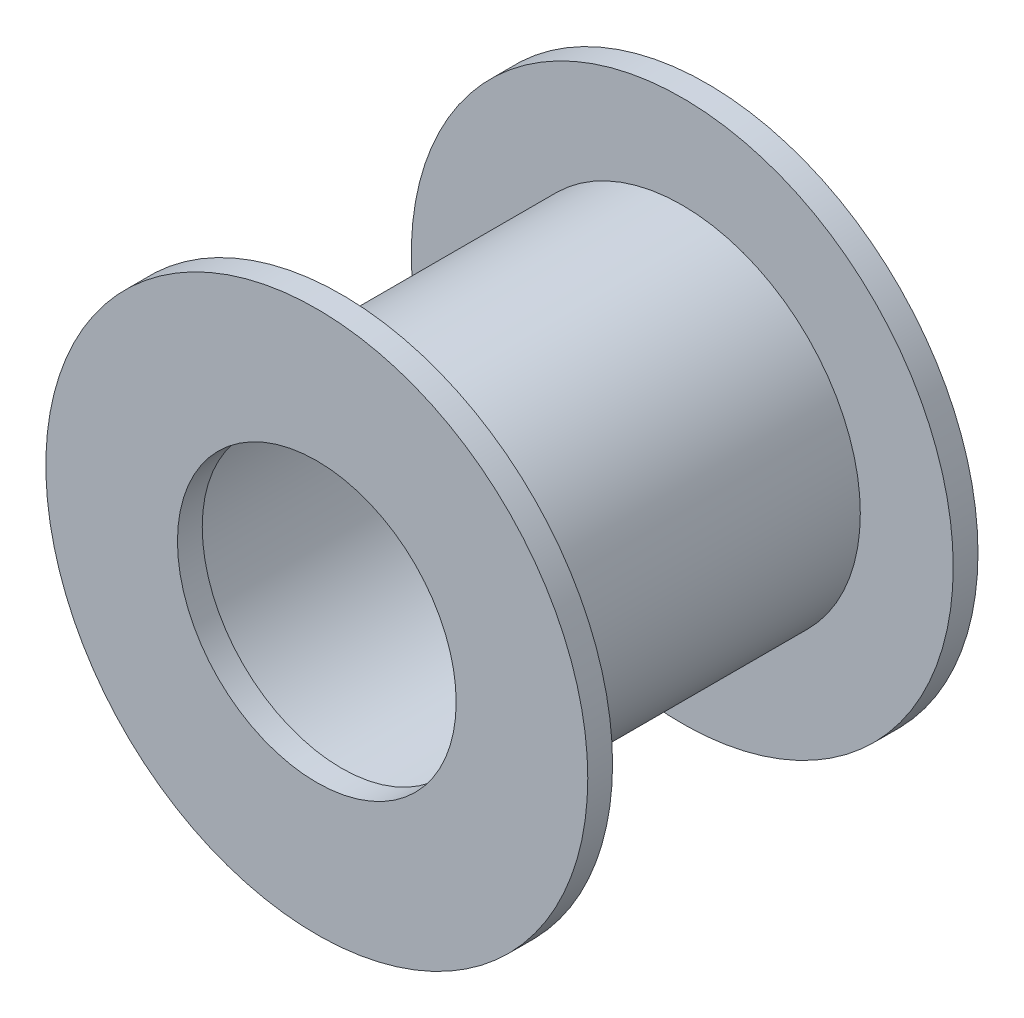
ISO-10303-21;
HEADER;
FILE_DESCRIPTION(('STEP AP214'),'2;1');
FILE_NAME('part.step','',(''),(''),'','','');
FILE_SCHEMA(('AUTOMOTIVE_DESIGN { 1 0 10303 214 1 1 1 1 }'));
ENDSEC;
DATA;
#1=APPLICATION_CONTEXT('core data for automotive mechanical design processes');
#2=APPLICATION_PROTOCOL_DEFINITION('international standard','automotive_design',2000,#1);
#3=PRODUCT_CONTEXT('',#1,'mechanical');
#4=PRODUCT('Part','Part','',(#3));
#5=PRODUCT_RELATED_PRODUCT_CATEGORY('part','',(#4));
#6=PRODUCT_DEFINITION_FORMATION('','',#4);
#7=PRODUCT_DEFINITION_CONTEXT('part definition',#1,'design');
#8=PRODUCT_DEFINITION('design','',#6,#7);
#9=PRODUCT_DEFINITION_SHAPE('','',#8);
#10=(LENGTH_UNIT() NAMED_UNIT(*) SI_UNIT(.MILLI.,.METRE.));
#11=(NAMED_UNIT(*) PLANE_ANGLE_UNIT() SI_UNIT($,.RADIAN.));
#12=(NAMED_UNIT(*) SI_UNIT($,.STERADIAN.) SOLID_ANGLE_UNIT());
#13=UNCERTAINTY_MEASURE_WITH_UNIT(LENGTH_MEASURE(1.E-05),#10,'distance_accuracy_value','');
#14=(GEOMETRIC_REPRESENTATION_CONTEXT(3) GLOBAL_UNCERTAINTY_ASSIGNED_CONTEXT((#13)) GLOBAL_UNIT_ASSIGNED_CONTEXT((#10,
#11,#12)) REPRESENTATION_CONTEXT('',''));
#15=CARTESIAN_POINT('',(0.,0.,0.));
#16=DIRECTION('',(0.,0.,1.));
#17=DIRECTION('',(1.,0.,0.));
#18=AXIS2_PLACEMENT_3D('',#15,#16,#17);
#19=CARTESIAN_POINT('',(0.,0.,252.));
#20=DIRECTION('',(0.,0.,-1.));
#21=DIRECTION('',(-1.,0.,0.));
#22=AXIS2_PLACEMENT_3D('',#19,#20,#21);
#23=CYLINDRICAL_SURFACE('',#22,175.);
#24=CARTESIAN_POINT('',(0.,0.,252.));
#25=DIRECTION('',(0.,0.,1.));
#26=DIRECTION('',(1.,0.,0.));
#27=AXIS2_PLACEMENT_3D('',#24,#25,#26);
#28=CIRCLE('',#27,175.);
#29=CARTESIAN_POINT('',(175.,0.,252.));
#30=VERTEX_POINT('',#29);
#31=EDGE_CURVE('E11',#30,#30,#28,.T.);
#32=ORIENTED_EDGE('',*,*,#31,.F.);
#33=EDGE_LOOP('',(#32));
#34=FACE_BOUND('',#33,.T.);
#35=CARTESIAN_POINT('',(0.,0.,236.));
#36=DIRECTION('',(0.,0.,1.));
#37=DIRECTION('',(1.,0.,0.));
#38=AXIS2_PLACEMENT_3D('',#35,#36,#37);
#39=CIRCLE('',#38,175.);
#40=CARTESIAN_POINT('',(175.,0.,236.));
#41=VERTEX_POINT('',#40);
#42=EDGE_CURVE('E49',#41,#41,#39,.T.);
#43=ORIENTED_EDGE('',*,*,#42,.T.);
#44=EDGE_LOOP('',(#43));
#45=FACE_BOUND('',#44,.T.);
#46=ADVANCED_FACE('F42',(#34,#45),#23,.T.);
#47=CARTESIAN_POINT('',(0.,0.,252.));
#48=DIRECTION('',(0.,0.,1.));
#49=DIRECTION('',(1.,0.,0.));
#50=AXIS2_PLACEMENT_3D('',#47,#48,#49);
#51=PLANE('',#50);
#52=CARTESIAN_POINT('',(0.,0.,252.));
#53=DIRECTION('',(0.,0.,1.));
#54=DIRECTION('',(1.,0.,0.));
#55=AXIS2_PLACEMENT_3D('',#52,#53,#54);
#56=CIRCLE('',#55,90.);
#57=CARTESIAN_POINT('',(90.,0.,252.));
#58=VERTEX_POINT('',#57);
#59=EDGE_CURVE('E55',#58,#58,#56,.T.);
#60=ORIENTED_EDGE('',*,*,#59,.F.);
#61=EDGE_LOOP('',(#60));
#62=FACE_BOUND('',#61,.T.);
#63=ORIENTED_EDGE('',*,*,#31,.T.);
#64=EDGE_LOOP('',(#63));
#65=FACE_BOUND('',#64,.T.);
#66=ADVANCED_FACE('F71',(#62,#65),#51,.T.);
#67=CARTESIAN_POINT('',(0.,0.,236.));
#68=DIRECTION('',(0.,0.,1.));
#69=DIRECTION('',(1.,0.,0.));
#70=AXIS2_PLACEMENT_3D('',#67,#68,#69);
#71=PLANE('',#70);
#72=CARTESIAN_POINT('',(0.,0.,236.));
#73=DIRECTION('',(0.,0.,1.));
#74=DIRECTION('',(1.,0.,0.));
#75=AXIS2_PLACEMENT_3D('',#72,#73,#74);
#76=CIRCLE('',#75,90.);
#77=CARTESIAN_POINT('',(90.,0.,236.));
#78=VERTEX_POINT('',#77);
#79=EDGE_CURVE('E45',#78,#78,#76,.T.);
#80=ORIENTED_EDGE('',*,*,#79,.T.);
#81=EDGE_LOOP('',(#80));
#82=FACE_BOUND('',#81,.T.);
#83=ORIENTED_EDGE('',*,*,#42,.F.);
#84=EDGE_LOOP('',(#83));
#85=FACE_BOUND('',#84,.T.);
#86=ADVANCED_FACE('F62',(#82,#85),#71,.F.);
#87=CARTESIAN_POINT('',(0.,0.,0.));
#88=DIRECTION('',(0.,0.,1.));
#89=DIRECTION('',(1.,0.,0.));
#90=AXIS2_PLACEMENT_3D('',#87,#88,#89);
#91=CYLINDRICAL_SURFACE('',#90,90.);
#92=ORIENTED_EDGE('',*,*,#59,.T.);
#93=EDGE_LOOP('',(#92));
#94=FACE_BOUND('',#93,.T.);
#95=ORIENTED_EDGE('',*,*,#79,.F.);
#96=EDGE_LOOP('',(#95));
#97=FACE_BOUND('',#96,.T.);
#98=ADVANCED_FACE('F65',(#94,#97),#91,.F.);
#99=CLOSED_SHELL('',(#46,#66,#86,#98));
#100=MANIFOLD_SOLID_BREP('B2',#99);
#101=CARTESIAN_POINT('',(0.,0.,236.));
#102=DIRECTION('',(0.,0.,1.));
#103=DIRECTION('',(1.,0.,0.));
#104=AXIS2_PLACEMENT_3D('',#101,#102,#103);
#105=PLANE('',#104);
#106=CARTESIAN_POINT('',(0.,0.,236.));
#107=DIRECTION('',(0.,0.,1.));
#108=DIRECTION('',(1.,0.,0.));
#109=AXIS2_PLACEMENT_3D('',#106,#107,#108);
#110=CIRCLE('',#109,115.);
#111=CARTESIAN_POINT('',(115.,0.,236.));
#112=VERTEX_POINT('',#111);
#113=EDGE_CURVE('E41',#112,#112,#110,.T.);
#114=ORIENTED_EDGE('',*,*,#113,.T.);
#115=EDGE_LOOP('',(#114));
#116=FACE_BOUND('',#115,.T.);
#117=CARTESIAN_POINT('',(0.,0.,236.));
#118=DIRECTION('',(0.,0.,1.));
#119=DIRECTION('',(1.,0.,0.));
#120=AXIS2_PLACEMENT_3D('',#117,#118,#119);
#121=CIRCLE('',#120,105.);
#122=CARTESIAN_POINT('',(105.,0.,236.));
#123=VERTEX_POINT('',#122);
#124=EDGE_CURVE('E122',#123,#123,#121,.T.);
#125=ORIENTED_EDGE('',*,*,#124,.F.);
#126=EDGE_LOOP('',(#125));
#127=FACE_BOUND('',#126,.T.);
#128=ADVANCED_FACE('F111',(#116,#127),#105,.T.);
#129=CARTESIAN_POINT('',(0.,0.,16.));
#130=DIRECTION('',(0.,0.,1.));
#131=DIRECTION('',(1.,0.,0.));
#132=AXIS2_PLACEMENT_3D('',#129,#130,#131);
#133=PLANE('',#132);
#134=CARTESIAN_POINT('',(0.,0.,16.));
#135=DIRECTION('',(0.,0.,1.));
#136=DIRECTION('',(1.,0.,0.));
#137=AXIS2_PLACEMENT_3D('',#134,#135,#136);
#138=CIRCLE('',#137,115.);
#139=CARTESIAN_POINT('',(115.,0.,16.));
#140=VERTEX_POINT('',#139);
#141=EDGE_CURVE('E115',#140,#140,#138,.T.);
#142=ORIENTED_EDGE('',*,*,#141,.F.);
#143=EDGE_LOOP('',(#142));
#144=FACE_BOUND('',#143,.T.);
#145=CARTESIAN_POINT('',(0.,0.,16.));
#146=DIRECTION('',(0.,0.,1.));
#147=DIRECTION('',(1.,0.,0.));
#148=AXIS2_PLACEMENT_3D('',#145,#146,#147);
#149=CIRCLE('',#148,105.);
#150=CARTESIAN_POINT('',(105.,0.,16.));
#151=VERTEX_POINT('',#150);
#152=EDGE_CURVE('E124',#151,#151,#149,.T.);
#153=ORIENTED_EDGE('',*,*,#152,.T.);
#154=EDGE_LOOP('',(#153));
#155=FACE_BOUND('',#154,.T.);
#156=ADVANCED_FACE('F134',(#144,#155),#133,.F.);
#157=CARTESIAN_POINT('',(0.,0.,236.));
#158=DIRECTION('',(0.,0.,-1.));
#159=DIRECTION('',(-1.,0.,0.));
#160=AXIS2_PLACEMENT_3D('',#157,#158,#159);
#161=CYLINDRICAL_SURFACE('',#160,115.);
#162=ORIENTED_EDGE('',*,*,#113,.F.);
#163=EDGE_LOOP('',(#162));
#164=FACE_BOUND('',#163,.T.);
#165=ORIENTED_EDGE('',*,*,#141,.T.);
#166=EDGE_LOOP('',(#165));
#167=FACE_BOUND('',#166,.T.);
#168=ADVANCED_FACE('F113',(#164,#167),#161,.T.);
#169=CARTESIAN_POINT('',(0.,0.,236.));
#170=DIRECTION('',(0.,0.,-1.));
#171=DIRECTION('',(-1.,0.,0.));
#172=AXIS2_PLACEMENT_3D('',#169,#170,#171);
#173=CYLINDRICAL_SURFACE('',#172,105.);
#174=ORIENTED_EDGE('',*,*,#124,.T.);
#175=EDGE_LOOP('',(#174));
#176=FACE_BOUND('',#175,.T.);
#177=ORIENTED_EDGE('',*,*,#152,.F.);
#178=EDGE_LOOP('',(#177));
#179=FACE_BOUND('',#178,.T.);
#180=ADVANCED_FACE('F130',(#176,#179),#173,.F.);
#181=CLOSED_SHELL('',(#128,#156,#168,#180));
#182=MANIFOLD_SOLID_BREP('B6',#181);
#183=CARTESIAN_POINT('',(0.,0.,16.));
#184=DIRECTION('',(0.,0.,-1.));
#185=DIRECTION('',(-1.,0.,0.));
#186=AXIS2_PLACEMENT_3D('',#183,#184,#185);
#187=CYLINDRICAL_SURFACE('',#186,175.);
#188=CARTESIAN_POINT('',(0.,0.,16.));
#189=DIRECTION('',(0.,0.,1.));
#190=DIRECTION('',(1.,0.,0.));
#191=AXIS2_PLACEMENT_3D('',#188,#189,#190);
#192=CIRCLE('',#191,175.);
#193=CARTESIAN_POINT('',(175.,0.,16.));
#194=VERTEX_POINT('',#193);
#195=EDGE_CURVE('E110',#194,#194,#192,.T.);
#196=ORIENTED_EDGE('',*,*,#195,.F.);
#197=EDGE_LOOP('',(#196));
#198=FACE_BOUND('',#197,.T.);
#199=CARTESIAN_POINT('',(0.,0.,0.));
#200=DIRECTION('',(0.,0.,1.));
#201=DIRECTION('',(1.,0.,0.));
#202=AXIS2_PLACEMENT_3D('',#199,#200,#201);
#203=CIRCLE('',#202,175.);
#204=CARTESIAN_POINT('',(175.,0.,0.));
#205=VERTEX_POINT('',#204);
#206=EDGE_CURVE('E176',#205,#205,#203,.T.);
#207=ORIENTED_EDGE('',*,*,#206,.T.);
#208=EDGE_LOOP('',(#207));
#209=FACE_BOUND('',#208,.T.);
#210=ADVANCED_FACE('F173',(#198,#209),#187,.T.);
#211=CARTESIAN_POINT('',(0.,0.,16.));
#212=DIRECTION('',(0.,0.,1.));
#213=DIRECTION('',(1.,0.,0.));
#214=AXIS2_PLACEMENT_3D('',#211,#212,#213);
#215=PLANE('',#214);
#216=CARTESIAN_POINT('',(0.,0.,16.));
#217=DIRECTION('',(0.,0.,1.));
#218=DIRECTION('',(1.,0.,0.));
#219=AXIS2_PLACEMENT_3D('',#216,#217,#218);
#220=CIRCLE('',#219,90.);
#221=CARTESIAN_POINT('',(90.,0.,16.));
#222=VERTEX_POINT('',#221);
#223=EDGE_CURVE('E183',#222,#222,#220,.T.);
#224=ORIENTED_EDGE('',*,*,#223,.F.);
#225=EDGE_LOOP('',(#224));
#226=FACE_BOUND('',#225,.T.);
#227=ORIENTED_EDGE('',*,*,#195,.T.);
#228=EDGE_LOOP('',(#227));
#229=FACE_BOUND('',#228,.T.);
#230=ADVANCED_FACE('F201',(#226,#229),#215,.T.);
#231=CARTESIAN_POINT('',(0.,0.,0.));
#232=DIRECTION('',(0.,0.,1.));
#233=DIRECTION('',(1.,0.,0.));
#234=AXIS2_PLACEMENT_3D('',#231,#232,#233);
#235=PLANE('',#234);
#236=CARTESIAN_POINT('',(0.,0.,0.));
#237=DIRECTION('',(0.,0.,1.));
#238=DIRECTION('',(1.,0.,0.));
#239=AXIS2_PLACEMENT_3D('',#236,#237,#238);
#240=CIRCLE('',#239,90.);
#241=CARTESIAN_POINT('',(90.,0.,0.));
#242=VERTEX_POINT('',#241);
#243=EDGE_CURVE('E187',#242,#242,#240,.T.);
#244=ORIENTED_EDGE('',*,*,#243,.T.);
#245=EDGE_LOOP('',(#244));
#246=FACE_BOUND('',#245,.T.);
#247=ORIENTED_EDGE('',*,*,#206,.F.);
#248=EDGE_LOOP('',(#247));
#249=FACE_BOUND('',#248,.T.);
#250=ADVANCED_FACE('F191',(#246,#249),#235,.F.);
#251=CARTESIAN_POINT('',(0.,0.,0.));
#252=DIRECTION('',(0.,0.,1.));
#253=DIRECTION('',(1.,0.,0.));
#254=AXIS2_PLACEMENT_3D('',#251,#252,#253);
#255=CYLINDRICAL_SURFACE('',#254,90.);
#256=ORIENTED_EDGE('',*,*,#223,.T.);
#257=EDGE_LOOP('',(#256));
#258=FACE_BOUND('',#257,.T.);
#259=ORIENTED_EDGE('',*,*,#243,.F.);
#260=EDGE_LOOP('',(#259));
#261=FACE_BOUND('',#260,.T.);
#262=ADVANCED_FACE('F194',(#258,#261),#255,.F.);
#263=CLOSED_SHELL('',(#210,#230,#250,#262));
#264=MANIFOLD_SOLID_BREP('B36',#263);
#265=ADVANCED_BREP_SHAPE_REPRESENTATION('',(#18,#100,#182,#264),#14);
#266=SHAPE_DEFINITION_REPRESENTATION(#9,#265);
ENDSEC;
END-ISO-10303-21;
